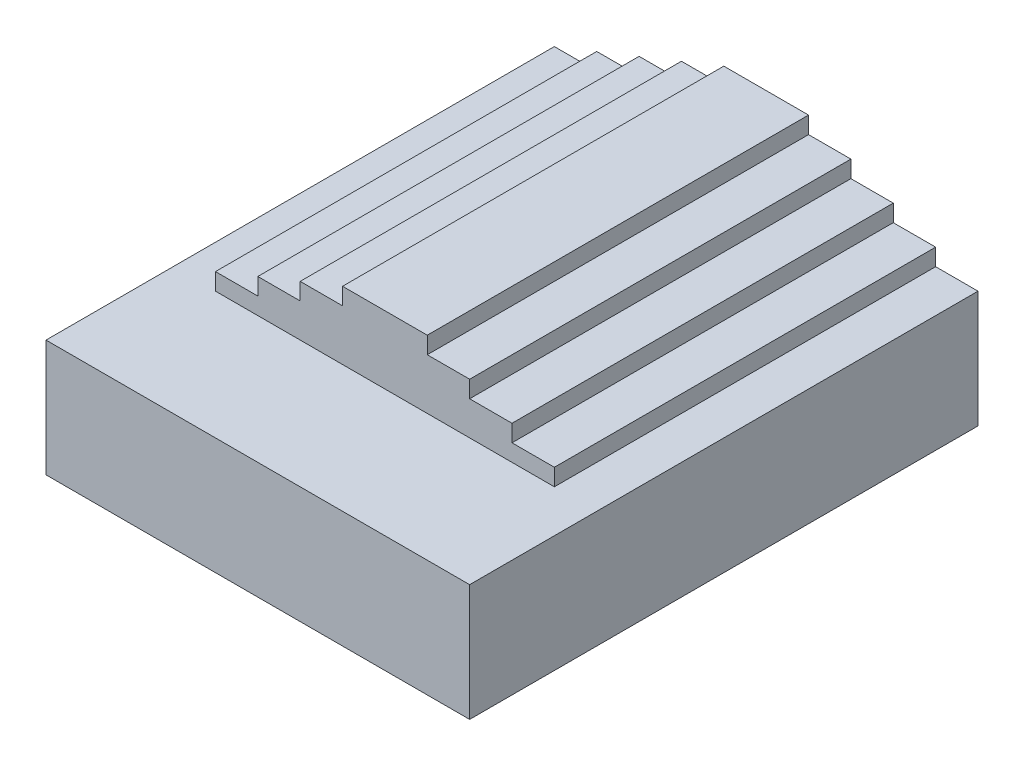
ISO-10303-21;
HEADER;
FILE_DESCRIPTION(('STEP AP214'),'2;1');
FILE_NAME('part.step','',(''),(''),'','','');
FILE_SCHEMA(('AUTOMOTIVE_DESIGN { 1 0 10303 214 1 1 1 1 }'));
ENDSEC;
DATA;
#1=APPLICATION_CONTEXT('core data for automotive mechanical design processes');
#2=APPLICATION_PROTOCOL_DEFINITION('international standard','automotive_design',2000,#1);
#3=PRODUCT_CONTEXT('',#1,'mechanical');
#4=PRODUCT('Part','Part','',(#3));
#5=PRODUCT_RELATED_PRODUCT_CATEGORY('part','',(#4));
#6=PRODUCT_DEFINITION_FORMATION('','',#4);
#7=PRODUCT_DEFINITION_CONTEXT('part definition',#1,'design');
#8=PRODUCT_DEFINITION('design','',#6,#7);
#9=PRODUCT_DEFINITION_SHAPE('','',#8);
#10=(LENGTH_UNIT() NAMED_UNIT(*) SI_UNIT(.MILLI.,.METRE.));
#11=(NAMED_UNIT(*) PLANE_ANGLE_UNIT() SI_UNIT($,.RADIAN.));
#12=(NAMED_UNIT(*) SI_UNIT($,.STERADIAN.) SOLID_ANGLE_UNIT());
#13=UNCERTAINTY_MEASURE_WITH_UNIT(LENGTH_MEASURE(1.E-05),#10,'distance_accuracy_value','');
#14=(GEOMETRIC_REPRESENTATION_CONTEXT(3) GLOBAL_UNCERTAINTY_ASSIGNED_CONTEXT((#13)) GLOBAL_UNIT_ASSIGNED_CONTEXT((#10,
#11,#12)) REPRESENTATION_CONTEXT('',''));
#15=CARTESIAN_POINT('',(0.,0.,0.));
#16=DIRECTION('',(0.,0.,1.));
#17=DIRECTION('',(1.,0.,0.));
#18=AXIS2_PLACEMENT_3D('',#15,#16,#17);
#19=CARTESIAN_POINT('',(-12.0175627764853,-4.00000000000001,60.));
#20=DIRECTION('',(-1.,0.,0.));
#21=DIRECTION('',(0.,0.,1.));
#22=AXIS2_PLACEMENT_3D('',#19,#20,#21);
#23=PLANE('',#22);
#24=DIRECTION('',(0.,0.,-1.));
#25=VECTOR('',#24,1.);
#26=CARTESIAN_POINT('',(-12.0175627764853,-2.00000000000001,60.));
#27=LINE('',#26,#25);
#28=CARTESIAN_POINT('',(-12.0175627764853,-2.00000000000001,45.));
#29=VERTEX_POINT('',#28);
#30=CARTESIAN_POINT('',(-12.0175627764853,-2.00000000000001,0.));
#31=VERTEX_POINT('',#30);
#32=EDGE_CURVE('E46',#29,#31,#27,.T.);
#33=ORIENTED_EDGE('',*,*,#32,.F.);
#34=DIRECTION('',(0.,-1.,0.));
#35=VECTOR('',#34,1.);
#36=CARTESIAN_POINT('',(-12.0175627764853,-4.00000000000001,45.));
#37=LINE('',#36,#35);
#38=CARTESIAN_POINT('',(-12.0175627764853,-4.00000000000001,45.));
#39=VERTEX_POINT('',#38);
#40=EDGE_CURVE('E318',#29,#39,#37,.T.);
#41=ORIENTED_EDGE('',*,*,#40,.T.);
#42=DIRECTION('',(0.,0.,-1.));
#43=VECTOR('',#42,1.);
#44=CARTESIAN_POINT('',(-12.0175627764853,-4.00000000000001,60.));
#45=LINE('',#44,#43);
#46=CARTESIAN_POINT('',(-12.0175627764853,-4.00000000000001,0.));
#47=VERTEX_POINT('',#46);
#48=EDGE_CURVE('E11',#39,#47,#45,.T.);
#49=ORIENTED_EDGE('',*,*,#48,.T.);
#50=DIRECTION('',(0.,1.,0.));
#51=VECTOR('',#50,1.);
#52=CARTESIAN_POINT('',(-12.0175627764853,-4.00000000000001,0.));
#53=LINE('',#52,#51);
#54=EDGE_CURVE('E246',#47,#31,#53,.T.);
#55=ORIENTED_EDGE('',*,*,#54,.T.);
#56=EDGE_LOOP('',(#33,#41,#49,#55));
#57=FACE_BOUND('',#56,.T.);
#58=ADVANCED_FACE('F38',(#57),#23,.F.);
#59=CARTESIAN_POINT('',(-12.0175627764853,-2.00000000000001,60.));
#60=DIRECTION('',(0.,-1.,0.));
#61=DIRECTION('',(1.,0.,0.));
#62=AXIS2_PLACEMENT_3D('',#59,#60,#61);
#63=PLANE('',#62);
#64=DIRECTION('',(0.,0.,-1.));
#65=VECTOR('',#64,1.);
#66=CARTESIAN_POINT('',(-17.0175627764852,-2.00000000000001,60.));
#67=LINE('',#66,#65);
#68=CARTESIAN_POINT('',(-17.0175627764852,-2.00000000000001,45.));
#69=VERTEX_POINT('',#68);
#70=CARTESIAN_POINT('',(-17.0175627764852,-2.00000000000001,0.));
#71=VERTEX_POINT('',#70);
#72=EDGE_CURVE('E232',#69,#71,#67,.T.);
#73=ORIENTED_EDGE('',*,*,#72,.F.);
#74=DIRECTION('',(1.,0.,0.));
#75=VECTOR('',#74,1.);
#76=CARTESIAN_POINT('',(-12.0175627764853,-2.00000000000001,45.));
#77=LINE('',#76,#75);
#78=EDGE_CURVE('E243',#69,#29,#77,.T.);
#79=ORIENTED_EDGE('',*,*,#78,.T.);
#80=ORIENTED_EDGE('',*,*,#32,.T.);
#81=DIRECTION('',(-1.,0.,0.));
#82=VECTOR('',#81,1.);
#83=CARTESIAN_POINT('',(-12.0175627764853,-2.00000000000001,0.));
#84=LINE('',#83,#82);
#85=EDGE_CURVE('E241',#31,#71,#84,.T.);
#86=ORIENTED_EDGE('',*,*,#85,.T.);
#87=EDGE_LOOP('',(#73,#79,#80,#86));
#88=FACE_BOUND('',#87,.T.);
#89=ADVANCED_FACE('F239',(#88),#63,.F.);
#90=CARTESIAN_POINT('',(-17.0175627764852,-2.00000000000001,60.));
#91=DIRECTION('',(-1.,0.,0.));
#92=DIRECTION('',(0.,0.,1.));
#93=AXIS2_PLACEMENT_3D('',#90,#91,#92);
#94=PLANE('',#93);
#95=DIRECTION('',(0.,0.,-1.));
#96=VECTOR('',#95,1.);
#97=CARTESIAN_POINT('',(-17.0175627764852,0.,60.));
#98=LINE('',#97,#96);
#99=CARTESIAN_POINT('',(-17.0175627764852,0.,45.));
#100=VERTEX_POINT('',#99);
#101=CARTESIAN_POINT('',(-17.0175627764852,0.,0.));
#102=VERTEX_POINT('',#101);
#103=EDGE_CURVE('E230',#100,#102,#98,.T.);
#104=ORIENTED_EDGE('',*,*,#103,.F.);
#105=DIRECTION('',(0.,-1.,0.));
#106=VECTOR('',#105,1.);
#107=CARTESIAN_POINT('',(-17.0175627764852,-2.00000000000001,45.));
#108=LINE('',#107,#106);
#109=EDGE_CURVE('E319',#100,#69,#108,.T.);
#110=ORIENTED_EDGE('',*,*,#109,.T.);
#111=ORIENTED_EDGE('',*,*,#72,.T.);
#112=DIRECTION('',(0.,1.,0.));
#113=VECTOR('',#112,1.);
#114=CARTESIAN_POINT('',(-17.0175627764852,-2.00000000000001,0.));
#115=LINE('',#114,#113);
#116=EDGE_CURVE('E252',#71,#102,#115,.T.);
#117=ORIENTED_EDGE('',*,*,#116,.T.);
#118=EDGE_LOOP('',(#104,#110,#111,#117));
#119=FACE_BOUND('',#118,.T.);
#120=ADVANCED_FACE('F398',(#119),#94,.F.);
#121=CARTESIAN_POINT('',(-17.0175627764852,0.,60.));
#122=DIRECTION('',(0.,-1.,0.));
#123=DIRECTION('',(1.,0.,0.));
#124=AXIS2_PLACEMENT_3D('',#121,#122,#123);
#125=PLANE('',#124);
#126=DIRECTION('',(0.,0.,-1.));
#127=VECTOR('',#126,1.);
#128=CARTESIAN_POINT('',(-22.0175627764852,0.,60.));
#129=LINE('',#128,#127);
#130=CARTESIAN_POINT('',(-22.0175627764852,0.,45.));
#131=VERTEX_POINT('',#130);
#132=CARTESIAN_POINT('',(-22.0175627764852,0.,0.));
#133=VERTEX_POINT('',#132);
#134=EDGE_CURVE('E228',#131,#133,#129,.T.);
#135=ORIENTED_EDGE('',*,*,#134,.F.);
#136=DIRECTION('',(1.,0.,0.));
#137=VECTOR('',#136,1.);
#138=CARTESIAN_POINT('',(-17.0175627764852,0.,45.));
#139=LINE('',#138,#137);
#140=EDGE_CURVE('E324',#131,#100,#139,.T.);
#141=ORIENTED_EDGE('',*,*,#140,.T.);
#142=ORIENTED_EDGE('',*,*,#103,.T.);
#143=DIRECTION('',(-1.,0.,0.));
#144=VECTOR('',#143,1.);
#145=CARTESIAN_POINT('',(-17.0175627764852,0.,0.));
#146=LINE('',#145,#144);
#147=EDGE_CURVE('E254',#102,#133,#146,.T.);
#148=ORIENTED_EDGE('',*,*,#147,.T.);
#149=EDGE_LOOP('',(#135,#141,#142,#148));
#150=FACE_BOUND('',#149,.T.);
#151=ADVANCED_FACE('F402',(#150),#125,.F.);
#152=CARTESIAN_POINT('',(-22.0175627764852,0.,60.));
#153=DIRECTION('',(-1.,0.,0.));
#154=DIRECTION('',(0.,0.,1.));
#155=AXIS2_PLACEMENT_3D('',#152,#153,#154);
#156=PLANE('',#155);
#157=DIRECTION('',(0.,0.,-1.));
#158=VECTOR('',#157,1.);
#159=CARTESIAN_POINT('',(-22.0175627764852,1.99999999999999,60.));
#160=LINE('',#159,#158);
#161=CARTESIAN_POINT('',(-22.0175627764852,1.99999999999999,45.));
#162=VERTEX_POINT('',#161);
#163=CARTESIAN_POINT('',(-22.0175627764852,1.99999999999999,0.));
#164=VERTEX_POINT('',#163);
#165=EDGE_CURVE('E226',#162,#164,#160,.T.);
#166=ORIENTED_EDGE('',*,*,#165,.F.);
#167=DIRECTION('',(0.,-1.,0.));
#168=VECTOR('',#167,1.);
#169=CARTESIAN_POINT('',(-22.0175627764852,0.,45.));
#170=LINE('',#169,#168);
#171=EDGE_CURVE('E327',#162,#131,#170,.T.);
#172=ORIENTED_EDGE('',*,*,#171,.T.);
#173=ORIENTED_EDGE('',*,*,#134,.T.);
#174=DIRECTION('',(0.,1.,0.));
#175=VECTOR('',#174,1.);
#176=CARTESIAN_POINT('',(-22.0175627764852,0.,0.));
#177=LINE('',#176,#175);
#178=EDGE_CURVE('E260',#133,#164,#177,.T.);
#179=ORIENTED_EDGE('',*,*,#178,.T.);
#180=EDGE_LOOP('',(#166,#172,#173,#179));
#181=FACE_BOUND('',#180,.T.);
#182=ADVANCED_FACE('F408',(#181),#156,.F.);
#183=CARTESIAN_POINT('',(-22.0175627764852,1.99999999999999,60.));
#184=DIRECTION('',(0.,-1.,0.));
#185=DIRECTION('',(1.,0.,0.));
#186=AXIS2_PLACEMENT_3D('',#183,#184,#185);
#187=PLANE('',#186);
#188=DIRECTION('',(0.,0.,-1.));
#189=VECTOR('',#188,1.);
#190=CARTESIAN_POINT('',(-27.0175627764852,2.,60.));
#191=LINE('',#190,#189);
#192=CARTESIAN_POINT('',(-27.0175627764852,2.,45.));
#193=VERTEX_POINT('',#192);
#194=CARTESIAN_POINT('',(-27.0175627764852,2.,0.));
#195=VERTEX_POINT('',#194);
#196=EDGE_CURVE('E224',#193,#195,#191,.T.);
#197=ORIENTED_EDGE('',*,*,#196,.F.);
#198=DIRECTION('',(1.,0.,0.));
#199=VECTOR('',#198,1.);
#200=CARTESIAN_POINT('',(-22.0175627764852,1.99999999999999,45.));
#201=LINE('',#200,#199);
#202=EDGE_CURVE('E330',#193,#162,#201,.T.);
#203=ORIENTED_EDGE('',*,*,#202,.T.);
#204=ORIENTED_EDGE('',*,*,#165,.T.);
#205=DIRECTION('',(-1.,0.,0.));
#206=VECTOR('',#205,1.);
#207=CARTESIAN_POINT('',(-22.0175627764852,1.99999999999999,0.));
#208=LINE('',#207,#206);
#209=EDGE_CURVE('E263',#164,#195,#208,.T.);
#210=ORIENTED_EDGE('',*,*,#209,.T.);
#211=EDGE_LOOP('',(#197,#203,#204,#210));
#212=FACE_BOUND('',#211,.T.);
#213=ADVANCED_FACE('F412',(#212),#187,.F.);
#214=CARTESIAN_POINT('',(-27.0175627764852,2.,60.));
#215=DIRECTION('',(-1.,0.,0.));
#216=DIRECTION('',(0.,-1.,0.));
#217=AXIS2_PLACEMENT_3D('',#214,#215,#216);
#218=PLANE('',#217);
#219=DIRECTION('',(0.,0.,-1.));
#220=VECTOR('',#219,1.);
#221=CARTESIAN_POINT('',(-27.0175627764852,4.,60.));
#222=LINE('',#221,#220);
#223=CARTESIAN_POINT('',(-27.0175627764852,4.,45.));
#224=VERTEX_POINT('',#223);
#225=CARTESIAN_POINT('',(-27.0175627764852,4.,0.));
#226=VERTEX_POINT('',#225);
#227=EDGE_CURVE('E222',#224,#226,#222,.T.);
#228=ORIENTED_EDGE('',*,*,#227,.F.);
#229=DIRECTION('',(0.,-1.,0.));
#230=VECTOR('',#229,1.);
#231=CARTESIAN_POINT('',(-27.0175627764852,2.,45.));
#232=LINE('',#231,#230);
#233=EDGE_CURVE('E333',#224,#193,#232,.T.);
#234=ORIENTED_EDGE('',*,*,#233,.T.);
#235=ORIENTED_EDGE('',*,*,#196,.T.);
#236=DIRECTION('',(0.,1.,0.));
#237=VECTOR('',#236,1.);
#238=CARTESIAN_POINT('',(-27.0175627764852,2.,0.));
#239=LINE('',#238,#237);
#240=EDGE_CURVE('E266',#195,#226,#239,.T.);
#241=ORIENTED_EDGE('',*,*,#240,.T.);
#242=EDGE_LOOP('',(#228,#234,#235,#241));
#243=FACE_BOUND('',#242,.T.);
#244=ADVANCED_FACE('F358',(#243),#218,.F.);
#245=CARTESIAN_POINT('',(-37.0175627764853,4.,60.));
#246=DIRECTION('',(0.,-1.,0.));
#247=DIRECTION('',(0.,0.,-1.));
#248=AXIS2_PLACEMENT_3D('',#245,#246,#247);
#249=PLANE('',#248);
#250=DIRECTION('',(0.,0.,-1.));
#251=VECTOR('',#250,1.);
#252=CARTESIAN_POINT('',(-37.0175627764853,4.,60.));
#253=LINE('',#252,#251);
#254=CARTESIAN_POINT('',(-37.0175627764853,4.,45.));
#255=VERTEX_POINT('',#254);
#256=CARTESIAN_POINT('',(-37.0175627764853,4.,0.));
#257=VERTEX_POINT('',#256);
#258=EDGE_CURVE('E220',#255,#257,#253,.T.);
#259=ORIENTED_EDGE('',*,*,#258,.F.);
#260=DIRECTION('',(1.,0.,0.));
#261=VECTOR('',#260,1.);
#262=CARTESIAN_POINT('',(-57.0175627764852,4.,45.));
#263=LINE('',#262,#261);
#264=EDGE_CURVE('E190',#255,#224,#263,.T.);
#265=ORIENTED_EDGE('',*,*,#264,.T.);
#266=ORIENTED_EDGE('',*,*,#227,.T.);
#267=DIRECTION('',(-1.,0.,0.));
#268=VECTOR('',#267,1.);
#269=CARTESIAN_POINT('',(-37.0175627764853,4.,0.));
#270=LINE('',#269,#268);
#271=EDGE_CURVE('E269',#226,#257,#270,.T.);
#272=ORIENTED_EDGE('',*,*,#271,.T.);
#273=EDGE_LOOP('',(#259,#265,#266,#272));
#274=FACE_BOUND('',#273,.T.);
#275=ADVANCED_FACE('F356',(#274),#249,.F.);
#276=CARTESIAN_POINT('',(-37.0175627764852,2.,60.));
#277=DIRECTION('',(1.,0.,0.));
#278=DIRECTION('',(0.,1.,0.));
#279=AXIS2_PLACEMENT_3D('',#276,#277,#278);
#280=PLANE('',#279);
#281=DIRECTION('',(0.,0.,-1.));
#282=VECTOR('',#281,1.);
#283=CARTESIAN_POINT('',(-37.0175627764852,2.,60.));
#284=LINE('',#283,#282);
#285=CARTESIAN_POINT('',(-37.0175627764852,2.,45.));
#286=VERTEX_POINT('',#285);
#287=CARTESIAN_POINT('',(-37.0175627764852,2.,0.));
#288=VERTEX_POINT('',#287);
#289=EDGE_CURVE('E218',#286,#288,#284,.T.);
#290=ORIENTED_EDGE('',*,*,#289,.F.);
#291=DIRECTION('',(0.,1.,0.));
#292=VECTOR('',#291,1.);
#293=CARTESIAN_POINT('',(-37.0175627764852,2.,45.));
#294=LINE('',#293,#292);
#295=EDGE_CURVE('E336',#286,#255,#294,.T.);
#296=ORIENTED_EDGE('',*,*,#295,.T.);
#297=ORIENTED_EDGE('',*,*,#258,.T.);
#298=DIRECTION('',(0.,-1.,0.));
#299=VECTOR('',#298,1.);
#300=CARTESIAN_POINT('',(-37.0175627764852,2.,0.));
#301=LINE('',#300,#299);
#302=EDGE_CURVE('E272',#257,#288,#301,.T.);
#303=ORIENTED_EDGE('',*,*,#302,.T.);
#304=EDGE_LOOP('',(#290,#296,#297,#303));
#305=FACE_BOUND('',#304,.T.);
#306=ADVANCED_FACE('F368',(#305),#280,.F.);
#307=CARTESIAN_POINT('',(-42.0175627764852,1.99999999999999,60.));
#308=DIRECTION('',(0.,-1.,0.));
#309=DIRECTION('',(1.,0.,0.));
#310=AXIS2_PLACEMENT_3D('',#307,#308,#309);
#311=PLANE('',#310);
#312=DIRECTION('',(0.,0.,-1.));
#313=VECTOR('',#312,1.);
#314=CARTESIAN_POINT('',(-42.0175627764852,1.99999999999999,60.));
#315=LINE('',#314,#313);
#316=CARTESIAN_POINT('',(-42.0175627764852,1.99999999999999,45.));
#317=VERTEX_POINT('',#316);
#318=CARTESIAN_POINT('',(-42.0175627764852,1.99999999999999,0.));
#319=VERTEX_POINT('',#318);
#320=EDGE_CURVE('E216',#317,#319,#315,.T.);
#321=ORIENTED_EDGE('',*,*,#320,.F.);
#322=DIRECTION('',(1.,0.,0.));
#323=VECTOR('',#322,1.);
#324=CARTESIAN_POINT('',(-42.0175627764852,1.99999999999999,45.));
#325=LINE('',#324,#323);
#326=EDGE_CURVE('E339',#317,#286,#325,.T.);
#327=ORIENTED_EDGE('',*,*,#326,.T.);
#328=ORIENTED_EDGE('',*,*,#289,.T.);
#329=DIRECTION('',(-1.,0.,0.));
#330=VECTOR('',#329,1.);
#331=CARTESIAN_POINT('',(-42.0175627764852,1.99999999999999,0.));
#332=LINE('',#331,#330);
#333=EDGE_CURVE('E275',#288,#319,#332,.T.);
#334=ORIENTED_EDGE('',*,*,#333,.T.);
#335=EDGE_LOOP('',(#321,#327,#328,#334));
#336=FACE_BOUND('',#335,.T.);
#337=ADVANCED_FACE('F371',(#336),#311,.F.);
#338=CARTESIAN_POINT('',(-42.0175627764852,0.,60.));
#339=DIRECTION('',(1.,0.,0.));
#340=DIRECTION('',(0.,0.,-1.));
#341=AXIS2_PLACEMENT_3D('',#338,#339,#340);
#342=PLANE('',#341);
#343=DIRECTION('',(0.,0.,-1.));
#344=VECTOR('',#343,1.);
#345=CARTESIAN_POINT('',(-42.0175627764852,0.,60.));
#346=LINE('',#345,#344);
#347=CARTESIAN_POINT('',(-42.0175627764852,0.,45.));
#348=VERTEX_POINT('',#347);
#349=CARTESIAN_POINT('',(-42.0175627764852,0.,0.));
#350=VERTEX_POINT('',#349);
#351=EDGE_CURVE('E214',#348,#350,#346,.T.);
#352=ORIENTED_EDGE('',*,*,#351,.F.);
#353=DIRECTION('',(0.,1.,0.));
#354=VECTOR('',#353,1.);
#355=CARTESIAN_POINT('',(-42.0175627764852,0.,45.));
#356=LINE('',#355,#354);
#357=EDGE_CURVE('E342',#348,#317,#356,.T.);
#358=ORIENTED_EDGE('',*,*,#357,.T.);
#359=ORIENTED_EDGE('',*,*,#320,.T.);
#360=DIRECTION('',(0.,-1.,0.));
#361=VECTOR('',#360,1.);
#362=CARTESIAN_POINT('',(-42.0175627764852,0.,0.));
#363=LINE('',#362,#361);
#364=EDGE_CURVE('E278',#319,#350,#363,.T.);
#365=ORIENTED_EDGE('',*,*,#364,.T.);
#366=EDGE_LOOP('',(#352,#358,#359,#365));
#367=FACE_BOUND('',#366,.T.);
#368=ADVANCED_FACE('F374',(#367),#342,.F.);
#369=CARTESIAN_POINT('',(-47.0175627764852,0.,60.));
#370=DIRECTION('',(0.,-1.,0.));
#371=DIRECTION('',(1.,0.,0.));
#372=AXIS2_PLACEMENT_3D('',#369,#370,#371);
#373=PLANE('',#372);
#374=DIRECTION('',(0.,0.,-1.));
#375=VECTOR('',#374,1.);
#376=CARTESIAN_POINT('',(-47.0175627764852,0.,60.));
#377=LINE('',#376,#375);
#378=CARTESIAN_POINT('',(-47.0175627764852,0.,45.));
#379=VERTEX_POINT('',#378);
#380=CARTESIAN_POINT('',(-47.0175627764852,0.,0.));
#381=VERTEX_POINT('',#380);
#382=EDGE_CURVE('E212',#379,#381,#377,.T.);
#383=ORIENTED_EDGE('',*,*,#382,.F.);
#384=DIRECTION('',(1.,0.,0.));
#385=VECTOR('',#384,1.);
#386=CARTESIAN_POINT('',(-47.0175627764852,0.,45.));
#387=LINE('',#386,#385);
#388=EDGE_CURVE('E345',#379,#348,#387,.T.);
#389=ORIENTED_EDGE('',*,*,#388,.T.);
#390=ORIENTED_EDGE('',*,*,#351,.T.);
#391=DIRECTION('',(-1.,0.,0.));
#392=VECTOR('',#391,1.);
#393=CARTESIAN_POINT('',(-47.0175627764852,0.,0.));
#394=LINE('',#393,#392);
#395=EDGE_CURVE('E281',#350,#381,#394,.T.);
#396=ORIENTED_EDGE('',*,*,#395,.T.);
#397=EDGE_LOOP('',(#383,#389,#390,#396));
#398=FACE_BOUND('',#397,.T.);
#399=ADVANCED_FACE('F378',(#398),#373,.F.);
#400=CARTESIAN_POINT('',(-47.0175627764852,-2.00000000000001,60.));
#401=DIRECTION('',(1.,0.,0.));
#402=DIRECTION('',(0.,0.,-1.));
#403=AXIS2_PLACEMENT_3D('',#400,#401,#402);
#404=PLANE('',#403);
#405=DIRECTION('',(0.,0.,-1.));
#406=VECTOR('',#405,1.);
#407=CARTESIAN_POINT('',(-47.0175627764852,-2.00000000000001,60.));
#408=LINE('',#407,#406);
#409=CARTESIAN_POINT('',(-47.0175627764852,-2.00000000000001,45.));
#410=VERTEX_POINT('',#409);
#411=CARTESIAN_POINT('',(-47.0175627764852,-2.00000000000001,0.));
#412=VERTEX_POINT('',#411);
#413=EDGE_CURVE('E205',#410,#412,#408,.T.);
#414=ORIENTED_EDGE('',*,*,#413,.F.);
#415=DIRECTION('',(0.,1.,0.));
#416=VECTOR('',#415,1.);
#417=CARTESIAN_POINT('',(-47.0175627764852,-2.00000000000001,45.));
#418=LINE('',#417,#416);
#419=EDGE_CURVE('E348',#410,#379,#418,.T.);
#420=ORIENTED_EDGE('',*,*,#419,.T.);
#421=ORIENTED_EDGE('',*,*,#382,.T.);
#422=DIRECTION('',(0.,-1.,0.));
#423=VECTOR('',#422,1.);
#424=CARTESIAN_POINT('',(-47.0175627764852,-2.00000000000001,0.));
#425=LINE('',#424,#423);
#426=EDGE_CURVE('E284',#381,#412,#425,.T.);
#427=ORIENTED_EDGE('',*,*,#426,.T.);
#428=EDGE_LOOP('',(#414,#420,#421,#427));
#429=FACE_BOUND('',#428,.T.);
#430=ADVANCED_FACE('F382',(#429),#404,.F.);
#431=CARTESIAN_POINT('',(-52.0175627764852,-2.00000000000001,60.));
#432=DIRECTION('',(0.,-1.,0.));
#433=DIRECTION('',(1.,0.,0.));
#434=AXIS2_PLACEMENT_3D('',#431,#432,#433);
#435=PLANE('',#434);
#436=DIRECTION('',(0.,0.,-1.));
#437=VECTOR('',#436,1.);
#438=CARTESIAN_POINT('',(-52.0175627764852,-2.00000000000001,60.));
#439=LINE('',#438,#437);
#440=CARTESIAN_POINT('',(-52.0175627764852,-2.00000000000001,45.));
#441=VERTEX_POINT('',#440);
#442=CARTESIAN_POINT('',(-52.0175627764852,-2.00000000000001,0.));
#443=VERTEX_POINT('',#442);
#444=EDGE_CURVE('E202',#441,#443,#439,.T.);
#445=ORIENTED_EDGE('',*,*,#444,.F.);
#446=DIRECTION('',(1.,0.,0.));
#447=VECTOR('',#446,1.);
#448=CARTESIAN_POINT('',(-52.0175627764852,-2.00000000000001,45.));
#449=LINE('',#448,#447);
#450=EDGE_CURVE('E186',#441,#410,#449,.T.);
#451=ORIENTED_EDGE('',*,*,#450,.T.);
#452=ORIENTED_EDGE('',*,*,#413,.T.);
#453=DIRECTION('',(-1.,0.,0.));
#454=VECTOR('',#453,1.);
#455=CARTESIAN_POINT('',(-52.0175627764852,-2.00000000000001,0.));
#456=LINE('',#455,#454);
#457=EDGE_CURVE('E287',#412,#443,#456,.T.);
#458=ORIENTED_EDGE('',*,*,#457,.T.);
#459=EDGE_LOOP('',(#445,#451,#452,#458));
#460=FACE_BOUND('',#459,.T.);
#461=ADVANCED_FACE('F385',(#460),#435,.F.);
#462=CARTESIAN_POINT('',(-52.0175627764852,-4.00000000000001,60.));
#463=DIRECTION('',(1.,0.,0.));
#464=DIRECTION('',(0.,0.,-1.));
#465=AXIS2_PLACEMENT_3D('',#462,#463,#464);
#466=PLANE('',#465);
#467=DIRECTION('',(0.,0.,-1.));
#468=VECTOR('',#467,1.);
#469=CARTESIAN_POINT('',(-52.0175627764852,-4.00000000000001,60.));
#470=LINE('',#469,#468);
#471=CARTESIAN_POINT('',(-52.0175627764852,-4.00000000000001,45.));
#472=VERTEX_POINT('',#471);
#473=CARTESIAN_POINT('',(-52.0175627764852,-4.00000000000001,0.));
#474=VERTEX_POINT('',#473);
#475=EDGE_CURVE('E195',#472,#474,#470,.T.);
#476=ORIENTED_EDGE('',*,*,#475,.F.);
#477=DIRECTION('',(0.,1.,0.));
#478=VECTOR('',#477,1.);
#479=CARTESIAN_POINT('',(-52.0175627764852,-4.00000000000001,45.));
#480=LINE('',#479,#478);
#481=EDGE_CURVE('E180',#472,#441,#480,.T.);
#482=ORIENTED_EDGE('',*,*,#481,.T.);
#483=ORIENTED_EDGE('',*,*,#444,.T.);
#484=DIRECTION('',(0.,-1.,0.));
#485=VECTOR('',#484,1.);
#486=CARTESIAN_POINT('',(-52.0175627764852,-4.00000000000001,0.));
#487=LINE('',#486,#485);
#488=EDGE_CURVE('E200',#443,#474,#487,.T.);
#489=ORIENTED_EDGE('',*,*,#488,.T.);
#490=EDGE_LOOP('',(#476,#482,#483,#489));
#491=FACE_BOUND('',#490,.T.);
#492=ADVANCED_FACE('F198',(#491),#466,.F.);
#493=CARTESIAN_POINT('',(-57.0175627764852,-4.00000000000001,60.));
#494=DIRECTION('',(0.,-1.,0.));
#495=DIRECTION('',(1.,0.,0.));
#496=AXIS2_PLACEMENT_3D('',#493,#494,#495);
#497=PLANE('',#496);
#498=DIRECTION('',(-1.,0.,0.));
#499=VECTOR('',#498,1.);
#500=CARTESIAN_POINT('',(-57.0175627764852,-4.00000000000001,0.));
#501=LINE('',#500,#499);
#502=CARTESIAN_POINT('',(-57.0175627764852,-4.00000000000001,0.));
#503=VERTEX_POINT('',#502);
#504=EDGE_CURVE('E291',#474,#503,#501,.T.);
#505=ORIENTED_EDGE('',*,*,#504,.T.);
#506=DIRECTION('',(0.,0.,-1.));
#507=VECTOR('',#506,1.);
#508=CARTESIAN_POINT('',(-57.0175627764852,-4.00000000000001,60.));
#509=LINE('',#508,#507);
#510=CARTESIAN_POINT('',(-57.0175627764852,-4.00000000000001,60.));
#511=VERTEX_POINT('',#510);
#512=EDGE_CURVE('E203',#511,#503,#509,.T.);
#513=ORIENTED_EDGE('',*,*,#512,.F.);
#514=DIRECTION('',(-1.,0.,0.));
#515=VECTOR('',#514,1.);
#516=CARTESIAN_POINT('',(-7.01756277648526,-4.00000000000001,60.));
#517=LINE('',#516,#515);
#518=CARTESIAN_POINT('',(-7.01756277648526,-4.00000000000001,60.));
#519=VERTEX_POINT('',#518);
#520=EDGE_CURVE('E129',#519,#511,#517,.T.);
#521=ORIENTED_EDGE('',*,*,#520,.F.);
#522=DIRECTION('',(0.,0.,-1.));
#523=VECTOR('',#522,1.);
#524=CARTESIAN_POINT('',(-7.01756277648526,-4.00000000000001,60.));
#525=LINE('',#524,#523);
#526=CARTESIAN_POINT('',(-7.01756277648526,-4.00000000000001,0.));
#527=VERTEX_POINT('',#526);
#528=EDGE_CURVE('E126',#519,#527,#525,.T.);
#529=ORIENTED_EDGE('',*,*,#528,.T.);
#530=DIRECTION('',(-1.,0.,0.));
#531=VECTOR('',#530,1.);
#532=CARTESIAN_POINT('',(-7.01756277648526,-4.00000000000001,0.));
#533=LINE('',#532,#531);
#534=EDGE_CURVE('E247',#527,#47,#533,.T.);
#535=ORIENTED_EDGE('',*,*,#534,.T.);
#536=ORIENTED_EDGE('',*,*,#48,.F.);
#537=DIRECTION('',(1.,0.,0.));
#538=VECTOR('',#537,1.);
#539=CARTESIAN_POINT('',(-57.0175627764852,-4.00000000000001,45.));
#540=LINE('',#539,#538);
#541=EDGE_CURVE('E183',#472,#39,#540,.T.);
#542=ORIENTED_EDGE('',*,*,#541,.F.);
#543=ORIENTED_EDGE('',*,*,#475,.T.);
#544=EDGE_LOOP('',(#505,#513,#521,#529,#535,#536,#542,#543));
#545=FACE_BOUND('',#544,.T.);
#546=ADVANCED_FACE('F194',(#545),#497,.F.);
#547=CARTESIAN_POINT('',(-57.0175627764852,-6.00000000000001,60.));
#548=DIRECTION('',(1.,0.,0.));
#549=DIRECTION('',(0.,0.,-1.));
#550=AXIS2_PLACEMENT_3D('',#547,#548,#549);
#551=PLANE('',#550);
#552=DIRECTION('',(0.,-1.,0.));
#553=VECTOR('',#552,1.);
#554=CARTESIAN_POINT('',(-57.0175627764852,-6.00000000000001,0.));
#555=LINE('',#554,#553);
#556=CARTESIAN_POINT('',(-57.0175627764852,-17.776315497068,0.));
#557=VERTEX_POINT('',#556);
#558=EDGE_CURVE('E293',#503,#557,#555,.T.);
#559=ORIENTED_EDGE('',*,*,#558,.T.);
#560=DIRECTION('',(0.,0.,-1.));
#561=VECTOR('',#560,1.);
#562=CARTESIAN_POINT('',(-57.0175627764852,-17.776315497068,60.));
#563=LINE('',#562,#561);
#564=CARTESIAN_POINT('',(-57.0175627764852,-17.776315497068,60.));
#565=VERTEX_POINT('',#564);
#566=EDGE_CURVE('E207',#565,#557,#563,.T.);
#567=ORIENTED_EDGE('',*,*,#566,.F.);
#568=DIRECTION('',(0.,-1.,0.));
#569=VECTOR('',#568,1.);
#570=CARTESIAN_POINT('',(-57.0175627764852,-6.00000000000001,60.));
#571=LINE('',#570,#569);
#572=EDGE_CURVE('E311',#511,#565,#571,.T.);
#573=ORIENTED_EDGE('',*,*,#572,.F.);
#574=ORIENTED_EDGE('',*,*,#512,.T.);
#575=EDGE_LOOP('',(#559,#567,#573,#574));
#576=FACE_BOUND('',#575,.T.);
#577=ADVANCED_FACE('F312',(#576),#551,.F.);
#578=CARTESIAN_POINT('',(-57.0175627764852,-17.776315497068,60.));
#579=DIRECTION('',(0.,1.,0.));
#580=DIRECTION('',(0.,0.,1.));
#581=AXIS2_PLACEMENT_3D('',#578,#579,#580);
#582=PLANE('',#581);
#583=DIRECTION('',(1.,0.,0.));
#584=VECTOR('',#583,1.);
#585=CARTESIAN_POINT('',(-57.0175627764852,-17.776315497068,0.));
#586=LINE('',#585,#584);
#587=CARTESIAN_POINT('',(-7.01756277648526,-17.776315497068,0.));
#588=VERTEX_POINT('',#587);
#589=EDGE_CURVE('E295',#557,#588,#586,.T.);
#590=ORIENTED_EDGE('',*,*,#589,.T.);
#591=DIRECTION('',(0.,0.,-1.));
#592=VECTOR('',#591,1.);
#593=CARTESIAN_POINT('',(-7.01756277648526,-17.776315497068,60.));
#594=LINE('',#593,#592);
#595=CARTESIAN_POINT('',(-7.01756277648526,-17.776315497068,60.));
#596=VERTEX_POINT('',#595);
#597=EDGE_CURVE('E299',#596,#588,#594,.T.);
#598=ORIENTED_EDGE('',*,*,#597,.F.);
#599=DIRECTION('',(1.,0.,0.));
#600=VECTOR('',#599,1.);
#601=CARTESIAN_POINT('',(-57.0175627764852,-17.776315497068,60.));
#602=LINE('',#601,#600);
#603=EDGE_CURVE('E307',#565,#596,#602,.T.);
#604=ORIENTED_EDGE('',*,*,#603,.F.);
#605=ORIENTED_EDGE('',*,*,#566,.T.);
#606=EDGE_LOOP('',(#590,#598,#604,#605));
#607=FACE_BOUND('',#606,.T.);
#608=ADVANCED_FACE('F305',(#607),#582,.F.);
#609=CARTESIAN_POINT('',(-7.01756277648526,-6.00000000000001,60.));
#610=DIRECTION('',(-1.,0.,0.));
#611=DIRECTION('',(0.,0.,1.));
#612=AXIS2_PLACEMENT_3D('',#609,#610,#611);
#613=PLANE('',#612);
#614=DIRECTION('',(0.,1.,0.));
#615=VECTOR('',#614,1.);
#616=CARTESIAN_POINT('',(-7.01756277648526,-6.00000000000001,0.));
#617=LINE('',#616,#615);
#618=EDGE_CURVE('E119',#588,#527,#617,.T.);
#619=ORIENTED_EDGE('',*,*,#618,.T.);
#620=ORIENTED_EDGE('',*,*,#528,.F.);
#621=DIRECTION('',(0.,1.,0.));
#622=VECTOR('',#621,1.);
#623=CARTESIAN_POINT('',(-7.01756277648526,-17.776315497068,60.));
#624=LINE('',#623,#622);
#625=EDGE_CURVE('E54',#596,#519,#624,.T.);
#626=ORIENTED_EDGE('',*,*,#625,.F.);
#627=ORIENTED_EDGE('',*,*,#597,.T.);
#628=EDGE_LOOP('',(#619,#620,#626,#627));
#629=FACE_BOUND('',#628,.T.);
#630=ADVANCED_FACE('F473',(#629),#613,.F.);
#631=CARTESIAN_POINT('',(0.,0.,60.));
#632=DIRECTION('',(0.,0.,-1.));
#633=DIRECTION('',(-1.,0.,0.));
#634=AXIS2_PLACEMENT_3D('',#631,#632,#633);
#635=PLANE('',#634);
#636=ORIENTED_EDGE('',*,*,#520,.T.);
#637=ORIENTED_EDGE('',*,*,#572,.T.);
#638=ORIENTED_EDGE('',*,*,#603,.T.);
#639=ORIENTED_EDGE('',*,*,#625,.T.);
#640=EDGE_LOOP('',(#636,#637,#638,#639));
#641=FACE_BOUND('',#640,.T.);
#642=ADVANCED_FACE('F478',(#641),#635,.F.);
#643=CARTESIAN_POINT('',(0.,0.,0.));
#644=DIRECTION('',(0.,0.,-1.));
#645=DIRECTION('',(-1.,0.,0.));
#646=AXIS2_PLACEMENT_3D('',#643,#644,#645);
#647=PLANE('',#646);
#648=ORIENTED_EDGE('',*,*,#534,.F.);
#649=ORIENTED_EDGE('',*,*,#618,.F.);
#650=ORIENTED_EDGE('',*,*,#589,.F.);
#651=ORIENTED_EDGE('',*,*,#558,.F.);
#652=ORIENTED_EDGE('',*,*,#504,.F.);
#653=ORIENTED_EDGE('',*,*,#488,.F.);
#654=ORIENTED_EDGE('',*,*,#457,.F.);
#655=ORIENTED_EDGE('',*,*,#426,.F.);
#656=ORIENTED_EDGE('',*,*,#395,.F.);
#657=ORIENTED_EDGE('',*,*,#364,.F.);
#658=ORIENTED_EDGE('',*,*,#333,.F.);
#659=ORIENTED_EDGE('',*,*,#302,.F.);
#660=ORIENTED_EDGE('',*,*,#271,.F.);
#661=ORIENTED_EDGE('',*,*,#240,.F.);
#662=ORIENTED_EDGE('',*,*,#209,.F.);
#663=ORIENTED_EDGE('',*,*,#178,.F.);
#664=ORIENTED_EDGE('',*,*,#147,.F.);
#665=ORIENTED_EDGE('',*,*,#116,.F.);
#666=ORIENTED_EDGE('',*,*,#85,.F.);
#667=ORIENTED_EDGE('',*,*,#54,.F.);
#668=EDGE_LOOP('',(#648,#649,#650,#651,#652,#653,#654,#655,#656,#657,#658,#659,#660,#661,#662,
#663,#664,#665,#666,#667));
#669=FACE_BOUND('',#668,.T.);
#670=ADVANCED_FACE('F249',(#669),#647,.T.);
#671=CARTESIAN_POINT('',(-57.0175627764852,4.,45.));
#672=DIRECTION('',(0.,0.,-1.));
#673=DIRECTION('',(-1.,0.,0.));
#674=AXIS2_PLACEMENT_3D('',#671,#672,#673);
#675=PLANE('',#674);
#676=ORIENTED_EDGE('',*,*,#78,.F.);
#677=ORIENTED_EDGE('',*,*,#109,.F.);
#678=ORIENTED_EDGE('',*,*,#140,.F.);
#679=ORIENTED_EDGE('',*,*,#171,.F.);
#680=ORIENTED_EDGE('',*,*,#202,.F.);
#681=ORIENTED_EDGE('',*,*,#233,.F.);
#682=ORIENTED_EDGE('',*,*,#264,.F.);
#683=ORIENTED_EDGE('',*,*,#295,.F.);
#684=ORIENTED_EDGE('',*,*,#326,.F.);
#685=ORIENTED_EDGE('',*,*,#357,.F.);
#686=ORIENTED_EDGE('',*,*,#388,.F.);
#687=ORIENTED_EDGE('',*,*,#419,.F.);
#688=ORIENTED_EDGE('',*,*,#450,.F.);
#689=ORIENTED_EDGE('',*,*,#481,.F.);
#690=ORIENTED_EDGE('',*,*,#541,.T.);
#691=ORIENTED_EDGE('',*,*,#40,.F.);
#692=EDGE_LOOP('',(#676,#677,#678,#679,#680,#681,#682,#683,#684,#685,#686,#687,#688,#689,#690,#691));
#693=FACE_BOUND('',#692,.T.);
#694=ADVANCED_FACE('F182',(#693),#675,.F.);
#695=CLOSED_SHELL('',(#58,#89,#120,#151,#182,#213,#244,#275,#306,#337,#368,#399,#430,#461,#492,
#546,#577,#608,#630,#642,#670,#694));
#696=MANIFOLD_SOLID_BREP('B2',#695);
#697=ADVANCED_BREP_SHAPE_REPRESENTATION('',(#18,#696),#14);
#698=SHAPE_DEFINITION_REPRESENTATION(#9,#697);
ENDSEC;
END-ISO-10303-21;
